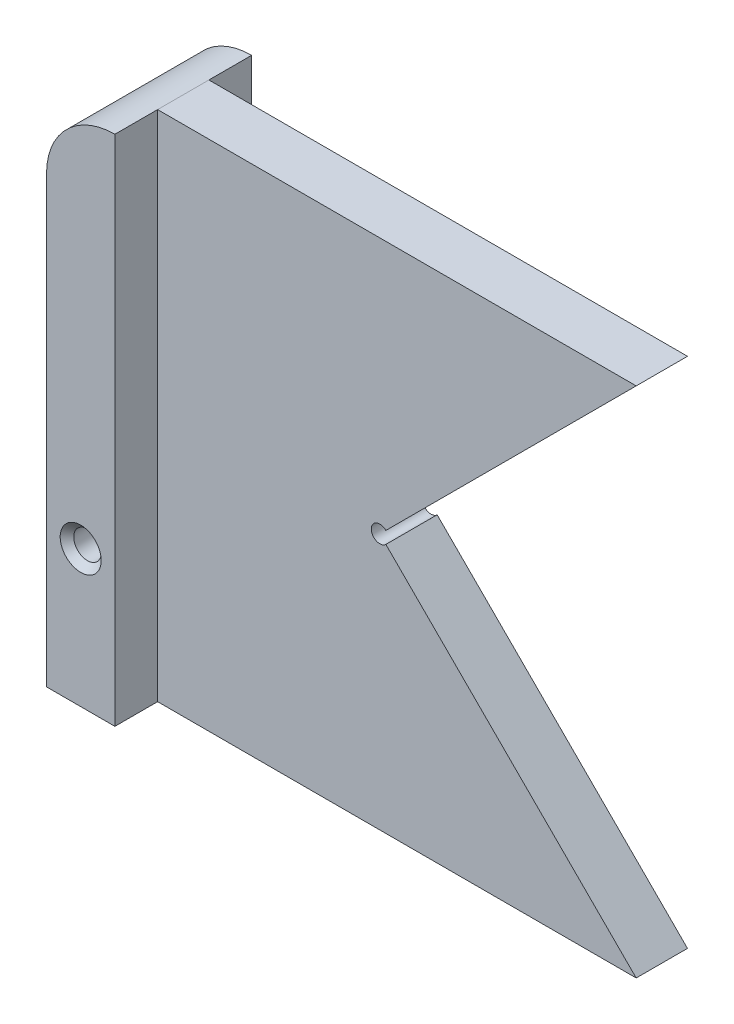
ISO-10303-21;
HEADER;
FILE_DESCRIPTION(('STEP AP214'),'2;1');
FILE_NAME('part.step','',(''),(''),'','','');
FILE_SCHEMA(('AUTOMOTIVE_DESIGN { 1 0 10303 214 1 1 1 1 }'));
ENDSEC;
DATA;
#1=APPLICATION_CONTEXT('core data for automotive mechanical design processes');
#2=APPLICATION_PROTOCOL_DEFINITION('international standard','automotive_design',2000,#1);
#3=PRODUCT_CONTEXT('',#1,'mechanical');
#4=PRODUCT('Part','Part','',(#3));
#5=PRODUCT_RELATED_PRODUCT_CATEGORY('part','',(#4));
#6=PRODUCT_DEFINITION_FORMATION('','',#4);
#7=PRODUCT_DEFINITION_CONTEXT('part definition',#1,'design');
#8=PRODUCT_DEFINITION('design','',#6,#7);
#9=PRODUCT_DEFINITION_SHAPE('','',#8);
#10=(LENGTH_UNIT() NAMED_UNIT(*) SI_UNIT(.MILLI.,.METRE.));
#11=(NAMED_UNIT(*) PLANE_ANGLE_UNIT() SI_UNIT($,.RADIAN.));
#12=(NAMED_UNIT(*) SI_UNIT($,.STERADIAN.) SOLID_ANGLE_UNIT());
#13=UNCERTAINTY_MEASURE_WITH_UNIT(LENGTH_MEASURE(1.E-05),#10,'distance_accuracy_value','');
#14=(GEOMETRIC_REPRESENTATION_CONTEXT(3) GLOBAL_UNCERTAINTY_ASSIGNED_CONTEXT((#13)) GLOBAL_UNIT_ASSIGNED_CONTEXT((#10,
#11,#12)) REPRESENTATION_CONTEXT('',''));
#15=CARTESIAN_POINT('',(0.,0.,0.));
#16=DIRECTION('',(0.,0.,1.));
#17=DIRECTION('',(1.,0.,0.));
#18=AXIS2_PLACEMENT_3D('',#15,#16,#17);
#19=CARTESIAN_POINT('',(0.,0.,12.7));
#20=DIRECTION('',(0.,0.,-1.));
#21=DIRECTION('',(-1.,0.,0.));
#22=AXIS2_PLACEMENT_3D('',#19,#20,#21);
#23=PLANE('',#22);
#24=DIRECTION('',(1.,0.,0.));
#25=VECTOR('',#24,1.);
#26=CARTESIAN_POINT('',(101.6,0.,12.7));
#27=LINE('',#26,#25);
#28=CARTESIAN_POINT('',(0.,0.,12.7));
#29=VERTEX_POINT('',#28);
#30=CARTESIAN_POINT('',(12.7,0.,12.7));
#31=VERTEX_POINT('',#30);
#32=EDGE_CURVE('E233',#29,#31,#27,.T.);
#33=ORIENTED_EDGE('',*,*,#32,.T.);
#34=DIRECTION('',(0.,1.,0.));
#35=VECTOR('',#34,1.);
#36=CARTESIAN_POINT('',(12.7,0.,12.7));
#37=LINE('',#36,#35);
#38=CARTESIAN_POINT('',(12.7,95.25,12.7));
#39=VERTEX_POINT('',#38);
#40=EDGE_CURVE('E177',#31,#39,#37,.T.);
#41=ORIENTED_EDGE('',*,*,#40,.T.);
#42=CARTESIAN_POINT('',(12.7,82.55,12.7));
#43=DIRECTION('',(0.,0.,-1.));
#44=DIRECTION('',(-1.,0.,0.));
#45=AXIS2_PLACEMENT_3D('',#42,#43,#44);
#46=CIRCLE('',#45,12.7);
#47=CARTESIAN_POINT('',(0.,82.55,12.7));
#48=VERTEX_POINT('',#47);
#49=EDGE_CURVE('E11',#39,#48,#46,.F.);
#50=ORIENTED_EDGE('',*,*,#49,.T.);
#51=DIRECTION('',(0.,-1.,0.));
#52=VECTOR('',#51,1.);
#53=CARTESIAN_POINT('',(0.,0.,12.7));
#54=LINE('',#53,#52);
#55=EDGE_CURVE('E236',#48,#29,#54,.T.);
#56=ORIENTED_EDGE('',*,*,#55,.T.);
#57=EDGE_LOOP('',(#33,#41,#50,#56));
#58=FACE_BOUND('',#57,.T.);
#59=CARTESIAN_POINT('',(6.35,25.4,12.7));
#60=DIRECTION('',(0.,0.,1.));
#61=DIRECTION('',(1.,0.,0.));
#62=AXIS2_PLACEMENT_3D('',#59,#60,#61);
#63=CIRCLE('',#62,3.81);
#64=CARTESIAN_POINT('',(10.16,25.4,12.7));
#65=VERTEX_POINT('',#64);
#66=EDGE_CURVE('E220',#65,#65,#63,.T.);
#67=ORIENTED_EDGE('',*,*,#66,.F.);
#68=EDGE_LOOP('',(#67));
#69=FACE_BOUND('',#68,.T.);
#70=ADVANCED_FACE('F38',(#58,#69),#23,.F.);
#71=CARTESIAN_POINT('',(0.,0.,-12.7));
#72=DIRECTION('',(0.,0.,-1.));
#73=DIRECTION('',(-1.,0.,0.));
#74=AXIS2_PLACEMENT_3D('',#71,#72,#73);
#75=PLANE('',#74);
#76=DIRECTION('',(0.,1.,0.));
#77=VECTOR('',#76,1.);
#78=CARTESIAN_POINT('',(12.7,0.,-12.7));
#79=LINE('',#78,#77);
#80=CARTESIAN_POINT('',(12.7,0.,-12.7));
#81=VERTEX_POINT('',#80);
#82=CARTESIAN_POINT('',(12.7,95.25,-12.7));
#83=VERTEX_POINT('',#82);
#84=EDGE_CURVE('E61',#81,#83,#79,.T.);
#85=ORIENTED_EDGE('',*,*,#84,.F.);
#86=DIRECTION('',(1.,0.,0.));
#87=VECTOR('',#86,1.);
#88=CARTESIAN_POINT('',(101.6,0.,-12.7));
#89=LINE('',#88,#87);
#90=CARTESIAN_POINT('',(0.,0.,-12.7));
#91=VERTEX_POINT('',#90);
#92=EDGE_CURVE('E232',#91,#81,#89,.T.);
#93=ORIENTED_EDGE('',*,*,#92,.F.);
#94=DIRECTION('',(0.,-1.,0.));
#95=VECTOR('',#94,1.);
#96=CARTESIAN_POINT('',(0.,0.,-12.7));
#97=LINE('',#96,#95);
#98=CARTESIAN_POINT('',(0.,82.55,-12.7));
#99=VERTEX_POINT('',#98);
#100=EDGE_CURVE('E237',#99,#91,#97,.T.);
#101=ORIENTED_EDGE('',*,*,#100,.F.);
#102=CARTESIAN_POINT('',(12.7,82.55,-12.7));
#103=DIRECTION('',(0.,0.,-1.));
#104=DIRECTION('',(-1.,0.,0.));
#105=AXIS2_PLACEMENT_3D('',#102,#103,#104);
#106=CIRCLE('',#105,12.7);
#107=EDGE_CURVE('E152',#99,#83,#106,.T.);
#108=ORIENTED_EDGE('',*,*,#107,.T.);
#109=EDGE_LOOP('',(#85,#93,#101,#108));
#110=FACE_BOUND('',#109,.T.);
#111=CARTESIAN_POINT('',(6.35,25.4,-12.7));
#112=DIRECTION('',(0.,0.,1.));
#113=DIRECTION('',(1.,0.,0.));
#114=AXIS2_PLACEMENT_3D('',#111,#112,#113);
#115=CIRCLE('',#114,3.80999999999999);
#116=CARTESIAN_POINT('',(10.16,25.4,-12.7));
#117=VERTEX_POINT('',#116);
#118=EDGE_CURVE('E217',#117,#117,#115,.T.);
#119=ORIENTED_EDGE('',*,*,#118,.T.);
#120=EDGE_LOOP('',(#119));
#121=FACE_BOUND('',#120,.T.);
#122=ADVANCED_FACE('F249',(#110,#121),#75,.T.);
#123=CARTESIAN_POINT('',(101.6,0.,12.7));
#124=DIRECTION('',(0.,1.,0.));
#125=DIRECTION('',(-1.,0.,0.));
#126=AXIS2_PLACEMENT_3D('',#123,#124,#125);
#127=PLANE('',#126);
#128=DIRECTION('',(-1.,0.,0.));
#129=VECTOR('',#128,1.);
#130=CARTESIAN_POINT('',(101.6,0.,4.7625));
#131=LINE('',#130,#129);
#132=CARTESIAN_POINT('',(101.6,0.,4.7625));
#133=VERTEX_POINT('',#132);
#134=CARTESIAN_POINT('',(12.7,0.,4.76250000000001));
#135=VERTEX_POINT('',#134);
#136=EDGE_CURVE('E119',#133,#135,#131,.T.);
#137=ORIENTED_EDGE('',*,*,#136,.T.);
#138=DIRECTION('',(0.,0.,1.));
#139=VECTOR('',#138,1.);
#140=CARTESIAN_POINT('',(12.7,0.,12.7));
#141=LINE('',#140,#139);
#142=EDGE_CURVE('E129',#135,#31,#141,.T.);
#143=ORIENTED_EDGE('',*,*,#142,.T.);
#144=ORIENTED_EDGE('',*,*,#32,.F.);
#145=DIRECTION('',(0.,0.,-1.));
#146=VECTOR('',#145,1.);
#147=CARTESIAN_POINT('',(0.,0.,12.7));
#148=LINE('',#147,#146);
#149=EDGE_CURVE('E154',#29,#91,#148,.T.);
#150=ORIENTED_EDGE('',*,*,#149,.T.);
#151=ORIENTED_EDGE('',*,*,#92,.T.);
#152=DIRECTION('',(0.,0.,1.));
#153=VECTOR('',#152,1.);
#154=CARTESIAN_POINT('',(12.7,0.,-12.7));
#155=LINE('',#154,#153);
#156=CARTESIAN_POINT('',(12.7,0.,-4.76249999999999));
#157=VERTEX_POINT('',#156);
#158=EDGE_CURVE('E184',#81,#157,#155,.T.);
#159=ORIENTED_EDGE('',*,*,#158,.T.);
#160=DIRECTION('',(1.,0.,0.));
#161=VECTOR('',#160,1.);
#162=CARTESIAN_POINT('',(101.6,0.,-4.7625));
#163=LINE('',#162,#161);
#164=CARTESIAN_POINT('',(101.6,0.,-4.7625));
#165=VERTEX_POINT('',#164);
#166=EDGE_CURVE('E147',#157,#165,#163,.T.);
#167=ORIENTED_EDGE('',*,*,#166,.T.);
#168=DIRECTION('',(0.,0.,-1.));
#169=VECTOR('',#168,1.);
#170=CARTESIAN_POINT('',(101.6,0.,12.7));
#171=LINE('',#170,#169);
#172=EDGE_CURVE('E136',#133,#165,#171,.T.);
#173=ORIENTED_EDGE('',*,*,#172,.F.);
#174=EDGE_LOOP('',(#137,#143,#144,#150,#151,#159,#167,#173));
#175=FACE_BOUND('',#174,.T.);
#176=ADVANCED_FACE('F144',(#175),#127,.F.);
#177=CARTESIAN_POINT('',(53.9749999999995,47.625,12.7));
#178=DIRECTION('',(-0.707106781186544,-0.707106781186551,0.));
#179=DIRECTION('',(0.707106781186551,-0.707106781186544,0.));
#180=AXIS2_PLACEMENT_3D('',#177,#178,#179);
#181=PLANE('',#180);
#182=DIRECTION('',(0.,0.,1.));
#183=VECTOR('',#182,1.);
#184=CARTESIAN_POINT('',(55.0975320151331,46.5024679848664,12.7));
#185=LINE('',#184,#183);
#186=CARTESIAN_POINT('',(55.0975320151331,46.5024679848664,-4.76249999999999));
#187=VERTEX_POINT('',#186);
#188=CARTESIAN_POINT('',(55.0975320151331,46.5024679848664,4.7625));
#189=VERTEX_POINT('',#188);
#190=EDGE_CURVE('E139',#187,#189,#185,.T.);
#191=ORIENTED_EDGE('',*,*,#190,.T.);
#192=DIRECTION('',(0.707106781186551,-0.707106781186544,0.));
#193=VECTOR('',#192,1.);
#194=CARTESIAN_POINT('',(53.9749999999995,47.625,4.7625));
#195=LINE('',#194,#193);
#196=EDGE_CURVE('E122',#189,#133,#195,.T.);
#197=ORIENTED_EDGE('',*,*,#196,.T.);
#198=ORIENTED_EDGE('',*,*,#172,.T.);
#199=DIRECTION('',(-0.707106781186551,0.707106781186544,0.));
#200=VECTOR('',#199,1.);
#201=CARTESIAN_POINT('',(53.9749999999995,47.625,-4.76249999999999));
#202=LINE('',#201,#200);
#203=EDGE_CURVE('E197',#165,#187,#202,.T.);
#204=ORIENTED_EDGE('',*,*,#203,.T.);
#205=EDGE_LOOP('',(#191,#197,#198,#204));
#206=FACE_BOUND('',#205,.T.);
#207=ADVANCED_FACE('F134',(#206),#181,.F.);
#208=CARTESIAN_POINT('',(101.6,95.25,12.7));
#209=DIRECTION('',(-0.707106781186544,0.707106781186551,0.));
#210=DIRECTION('',(-0.707106781186551,-0.707106781186544,0.));
#211=AXIS2_PLACEMENT_3D('',#208,#209,#210);
#212=PLANE('',#211);
#213=DIRECTION('',(0.,0.,-1.));
#214=VECTOR('',#213,1.);
#215=CARTESIAN_POINT('',(101.6,95.25,12.7));
#216=LINE('',#215,#214);
#217=CARTESIAN_POINT('',(101.6,95.25,4.7625));
#218=VERTEX_POINT('',#217);
#219=CARTESIAN_POINT('',(101.6,95.25,-4.7625));
#220=VERTEX_POINT('',#219);
#221=EDGE_CURVE('E149',#218,#220,#216,.T.);
#222=ORIENTED_EDGE('',*,*,#221,.F.);
#223=DIRECTION('',(-0.707106781186551,-0.707106781186544,0.));
#224=VECTOR('',#223,1.);
#225=CARTESIAN_POINT('',(101.6,95.25,4.7625));
#226=LINE('',#225,#224);
#227=CARTESIAN_POINT('',(55.0975320151331,48.7475320151336,4.7625));
#228=VERTEX_POINT('',#227);
#229=EDGE_CURVE('E141',#218,#228,#226,.T.);
#230=ORIENTED_EDGE('',*,*,#229,.T.);
#231=DIRECTION('',(0.,0.,1.));
#232=VECTOR('',#231,1.);
#233=CARTESIAN_POINT('',(55.0975320151331,48.7475320151336,12.7));
#234=LINE('',#233,#232);
#235=CARTESIAN_POINT('',(55.0975320151331,48.7475320151336,-4.76249999999999));
#236=VERTEX_POINT('',#235);
#237=EDGE_CURVE('E229',#228,#236,#234,.F.);
#238=ORIENTED_EDGE('',*,*,#237,.T.);
#239=DIRECTION('',(0.707106781186551,0.707106781186544,0.));
#240=VECTOR('',#239,1.);
#241=CARTESIAN_POINT('',(101.6,95.25,-4.7625));
#242=LINE('',#241,#240);
#243=EDGE_CURVE('E194',#236,#220,#242,.T.);
#244=ORIENTED_EDGE('',*,*,#243,.T.);
#245=EDGE_LOOP('',(#222,#230,#238,#244));
#246=FACE_BOUND('',#245,.T.);
#247=ADVANCED_FACE('F277',(#246),#212,.F.);
#248=CARTESIAN_POINT('',(0.,95.25,12.7));
#249=DIRECTION('',(0.,-1.,0.));
#250=DIRECTION('',(0.,0.,-1.));
#251=AXIS2_PLACEMENT_3D('',#248,#249,#250);
#252=PLANE('',#251);
#253=DIRECTION('',(0.,0.,-1.));
#254=VECTOR('',#253,1.);
#255=CARTESIAN_POINT('',(12.7,95.25,12.7));
#256=LINE('',#255,#254);
#257=CARTESIAN_POINT('',(12.7,95.25,-4.76249999999999));
#258=VERTEX_POINT('',#257);
#259=CARTESIAN_POINT('',(12.7,95.25,4.7625));
#260=VERTEX_POINT('',#259);
#261=EDGE_CURVE('E158',#258,#260,#256,.F.);
#262=ORIENTED_EDGE('',*,*,#261,.T.);
#263=DIRECTION('',(-1.,0.,0.));
#264=VECTOR('',#263,1.);
#265=CARTESIAN_POINT('',(101.6,95.25,4.7625));
#266=LINE('',#265,#264);
#267=EDGE_CURVE('E53',#218,#260,#266,.T.);
#268=ORIENTED_EDGE('',*,*,#267,.F.);
#269=ORIENTED_EDGE('',*,*,#221,.T.);
#270=DIRECTION('',(1.,0.,0.));
#271=VECTOR('',#270,1.);
#272=CARTESIAN_POINT('',(101.6,95.25,-4.7625));
#273=LINE('',#272,#271);
#274=EDGE_CURVE('E140',#258,#220,#273,.T.);
#275=ORIENTED_EDGE('',*,*,#274,.F.);
#276=EDGE_LOOP('',(#262,#268,#269,#275));
#277=FACE_BOUND('',#276,.T.);
#278=ADVANCED_FACE('F164',(#277),#252,.F.);
#279=CARTESIAN_POINT('',(0.,0.,12.7));
#280=DIRECTION('',(1.,0.,0.));
#281=DIRECTION('',(0.,0.,-1.));
#282=AXIS2_PLACEMENT_3D('',#279,#280,#281);
#283=PLANE('',#282);
#284=CARTESIAN_POINT('',(0.,41.275,0.));
#285=DIRECTION('',(-1.,0.,0.));
#286=DIRECTION('',(0.,0.,1.));
#287=AXIS2_PLACEMENT_3D('',#284,#285,#286);
#288=CIRCLE('',#287,3.81);
#289=CARTESIAN_POINT('',(0.,41.275,3.81));
#290=VERTEX_POINT('',#289);
#291=EDGE_CURVE('E199',#290,#290,#288,.T.);
#292=ORIENTED_EDGE('',*,*,#291,.F.);
#293=EDGE_LOOP('',(#292));
#294=FACE_BOUND('',#293,.T.);
#295=CARTESIAN_POINT('',(0.,9.525,0.));
#296=DIRECTION('',(-1.,0.,0.));
#297=DIRECTION('',(0.,0.,1.));
#298=AXIS2_PLACEMENT_3D('',#295,#296,#297);
#299=CIRCLE('',#298,3.81);
#300=CARTESIAN_POINT('',(0.,9.525,3.81));
#301=VERTEX_POINT('',#300);
#302=EDGE_CURVE('E208',#301,#301,#299,.T.);
#303=ORIENTED_EDGE('',*,*,#302,.F.);
#304=EDGE_LOOP('',(#303));
#305=FACE_BOUND('',#304,.T.);
#306=ORIENTED_EDGE('',*,*,#55,.F.);
#307=DIRECTION('',(0.,0.,-1.));
#308=VECTOR('',#307,1.);
#309=CARTESIAN_POINT('',(0.,82.55,12.7));
#310=LINE('',#309,#308);
#311=EDGE_CURVE('E148',#48,#99,#310,.T.);
#312=ORIENTED_EDGE('',*,*,#311,.T.);
#313=ORIENTED_EDGE('',*,*,#100,.T.);
#314=ORIENTED_EDGE('',*,*,#149,.F.);
#315=EDGE_LOOP('',(#306,#312,#313,#314));
#316=FACE_BOUND('',#315,.T.);
#317=ADVANCED_FACE('F251',(#294,#305,#316),#283,.F.);
#318=CARTESIAN_POINT('',(53.9749999999995,47.625,12.7));
#319=DIRECTION('',(0.,0.,1.));
#320=DIRECTION('',(1.,0.,0.));
#321=AXIS2_PLACEMENT_3D('',#318,#319,#320);
#322=CYLINDRICAL_SURFACE('',#321,1.58749999999998);
#323=ORIENTED_EDGE('',*,*,#237,.F.);
#324=CARTESIAN_POINT('',(53.9749999999995,47.625,4.7625));
#325=DIRECTION('',(0.,0.,-1.));
#326=DIRECTION('',(-1.,0.,0.));
#327=AXIS2_PLACEMENT_3D('',#324,#325,#326);
#328=CIRCLE('',#327,1.58749999999998);
#329=EDGE_CURVE('E179',#228,#189,#328,.F.);
#330=ORIENTED_EDGE('',*,*,#329,.T.);
#331=ORIENTED_EDGE('',*,*,#190,.F.);
#332=CARTESIAN_POINT('',(53.9749999999995,47.625,-4.76249999999999));
#333=DIRECTION('',(0.,0.,1.));
#334=DIRECTION('',(1.,0.,0.));
#335=AXIS2_PLACEMENT_3D('',#332,#333,#334);
#336=CIRCLE('',#335,1.58749999999998);
#337=EDGE_CURVE('E190',#187,#236,#336,.F.);
#338=ORIENTED_EDGE('',*,*,#337,.T.);
#339=EDGE_LOOP('',(#323,#330,#331,#338));
#340=FACE_BOUND('',#339,.T.);
#341=ADVANCED_FACE('F269',(#340),#322,.F.);
#342=CARTESIAN_POINT('',(12.7,82.55,12.7));
#343=DIRECTION('',(0.,0.,-1.));
#344=DIRECTION('',(-1.,0.,0.));
#345=AXIS2_PLACEMENT_3D('',#342,#343,#344);
#346=CYLINDRICAL_SURFACE('',#345,12.7);
#347=ORIENTED_EDGE('',*,*,#49,.F.);
#348=DIRECTION('',(0.,0.,1.));
#349=VECTOR('',#348,1.);
#350=CARTESIAN_POINT('',(12.7,95.25,12.7));
#351=LINE('',#350,#349);
#352=EDGE_CURVE('E130',#260,#39,#351,.T.);
#353=ORIENTED_EDGE('',*,*,#352,.F.);
#354=ORIENTED_EDGE('',*,*,#261,.F.);
#355=EDGE_CURVE('E46',#83,#258,#256,.F.);
#356=ORIENTED_EDGE('',*,*,#355,.F.);
#357=ORIENTED_EDGE('',*,*,#107,.F.);
#358=ORIENTED_EDGE('',*,*,#311,.F.);
#359=EDGE_LOOP('',(#347,#353,#354,#356,#357,#358));
#360=FACE_BOUND('',#359,.T.);
#361=ADVANCED_FACE('F40',(#360),#346,.T.);
#362=CARTESIAN_POINT('',(6.35,25.4,-11.4427));
#363=DIRECTION('',(0.,0.,-1.));
#364=DIRECTION('',(-1.,0.,0.));
#365=AXIS2_PLACEMENT_3D('',#362,#363,#364);
#366=CONICAL_SURFACE('',#365,2.55269999999999,0.785398163397448);
#367=ORIENTED_EDGE('',*,*,#118,.F.);
#368=EDGE_LOOP('',(#367));
#369=FACE_BOUND('',#368,.T.);
#370=CARTESIAN_POINT('',(6.35,25.4,-11.4427));
#371=DIRECTION('',(0.,0.,1.));
#372=DIRECTION('',(1.,0.,0.));
#373=AXIS2_PLACEMENT_3D('',#370,#371,#372);
#374=CIRCLE('',#373,2.55269999999999);
#375=CARTESIAN_POINT('',(8.90269999999999,25.4,-11.4427));
#376=VERTEX_POINT('',#375);
#377=EDGE_CURVE('E226',#376,#376,#374,.T.);
#378=ORIENTED_EDGE('',*,*,#377,.T.);
#379=EDGE_LOOP('',(#378));
#380=FACE_BOUND('',#379,.T.);
#381=ADVANCED_FACE('F317',(#369,#380),#366,.F.);
#382=CARTESIAN_POINT('',(6.35,25.4,12.7));
#383=DIRECTION('',(0.,0.,1.));
#384=DIRECTION('',(1.,0.,0.));
#385=AXIS2_PLACEMENT_3D('',#382,#383,#384);
#386=CYLINDRICAL_SURFACE('',#385,2.5527);
#387=ORIENTED_EDGE('',*,*,#377,.F.);
#388=EDGE_LOOP('',(#387));
#389=FACE_BOUND('',#388,.T.);
#390=CARTESIAN_POINT('',(6.35,25.4,11.4427));
#391=DIRECTION('',(0.,0.,1.));
#392=DIRECTION('',(1.,0.,0.));
#393=AXIS2_PLACEMENT_3D('',#390,#391,#392);
#394=CIRCLE('',#393,2.5527);
#395=CARTESIAN_POINT('',(8.9027,25.4,11.4427));
#396=VERTEX_POINT('',#395);
#397=EDGE_CURVE('E223',#396,#396,#394,.T.);
#398=ORIENTED_EDGE('',*,*,#397,.T.);
#399=EDGE_LOOP('',(#398));
#400=FACE_BOUND('',#399,.T.);
#401=ADVANCED_FACE('F324',(#389,#400),#386,.F.);
#402=CARTESIAN_POINT('',(6.35,25.4,12.7));
#403=DIRECTION('',(0.,0.,1.));
#404=DIRECTION('',(1.,0.,0.));
#405=AXIS2_PLACEMENT_3D('',#402,#403,#404);
#406=CONICAL_SURFACE('',#405,3.81,0.785398163397448);
#407=ORIENTED_EDGE('',*,*,#397,.F.);
#408=EDGE_LOOP('',(#407));
#409=FACE_BOUND('',#408,.T.);
#410=ORIENTED_EDGE('',*,*,#66,.T.);
#411=EDGE_LOOP('',(#410));
#412=FACE_BOUND('',#411,.T.);
#413=ADVANCED_FACE('F332',(#409,#412),#406,.F.);
#414=CARTESIAN_POINT('',(15.875,9.525,0.));
#415=DIRECTION('',(-1.,0.,0.));
#416=DIRECTION('',(0.,0.,1.));
#417=AXIS2_PLACEMENT_3D('',#414,#415,#416);
#418=CONICAL_SURFACE('',#417,2.5527,1.02974425867665);
#419=CARTESIAN_POINT('',(17.4088169021917,9.525,0.));
#420=VERTEX_POINT('',#419);
#421=VERTEX_LOOP('',#420);
#422=FACE_BOUND('',#421,.T.);
#423=CARTESIAN_POINT('',(15.875,9.525,0.));
#424=DIRECTION('',(-1.,0.,0.));
#425=DIRECTION('',(0.,0.,1.));
#426=AXIS2_PLACEMENT_3D('',#423,#424,#425);
#427=CIRCLE('',#426,2.5527);
#428=CARTESIAN_POINT('',(15.875,9.525,2.5527));
#429=VERTEX_POINT('',#428);
#430=EDGE_CURVE('E214',#429,#429,#427,.T.);
#431=ORIENTED_EDGE('',*,*,#430,.T.);
#432=EDGE_LOOP('',(#431));
#433=FACE_BOUND('',#432,.T.);
#434=ADVANCED_FACE('F339',(#422,#433),#418,.F.);
#435=CARTESIAN_POINT('',(0.,9.525,0.));
#436=DIRECTION('',(-1.,0.,0.));
#437=DIRECTION('',(0.,0.,1.));
#438=AXIS2_PLACEMENT_3D('',#435,#436,#437);
#439=CYLINDRICAL_SURFACE('',#438,2.5527);
#440=ORIENTED_EDGE('',*,*,#430,.F.);
#441=EDGE_LOOP('',(#440));
#442=FACE_BOUND('',#441,.T.);
#443=CARTESIAN_POINT('',(1.2573,9.525,0.));
#444=DIRECTION('',(-1.,0.,0.));
#445=DIRECTION('',(0.,0.,1.));
#446=AXIS2_PLACEMENT_3D('',#443,#444,#445);
#447=CIRCLE('',#446,2.5527);
#448=CARTESIAN_POINT('',(1.2573,9.525,2.5527));
#449=VERTEX_POINT('',#448);
#450=EDGE_CURVE('E211',#449,#449,#447,.T.);
#451=ORIENTED_EDGE('',*,*,#450,.T.);
#452=EDGE_LOOP('',(#451));
#453=FACE_BOUND('',#452,.T.);
#454=ADVANCED_FACE('F346',(#442,#453),#439,.F.);
#455=CARTESIAN_POINT('',(0.,9.525,0.));
#456=DIRECTION('',(-1.,0.,0.));
#457=DIRECTION('',(0.,0.,1.));
#458=AXIS2_PLACEMENT_3D('',#455,#456,#457);
#459=CONICAL_SURFACE('',#458,3.81,0.785398163397449);
#460=ORIENTED_EDGE('',*,*,#450,.F.);
#461=EDGE_LOOP('',(#460));
#462=FACE_BOUND('',#461,.T.);
#463=ORIENTED_EDGE('',*,*,#302,.T.);
#464=EDGE_LOOP('',(#463));
#465=FACE_BOUND('',#464,.T.);
#466=ADVANCED_FACE('F355',(#462,#465),#459,.F.);
#467=CARTESIAN_POINT('',(15.875,41.275,0.));
#468=DIRECTION('',(-1.,0.,0.));
#469=DIRECTION('',(0.,0.,1.));
#470=AXIS2_PLACEMENT_3D('',#467,#468,#469);
#471=CONICAL_SURFACE('',#470,2.5527,1.02974425867665);
#472=CARTESIAN_POINT('',(17.4088169021917,41.275,0.));
#473=VERTEX_POINT('',#472);
#474=VERTEX_LOOP('',#473);
#475=FACE_BOUND('',#474,.T.);
#476=CARTESIAN_POINT('',(15.875,41.275,0.));
#477=DIRECTION('',(-1.,0.,0.));
#478=DIRECTION('',(0.,0.,1.));
#479=AXIS2_PLACEMENT_3D('',#476,#477,#478);
#480=CIRCLE('',#479,2.5527);
#481=CARTESIAN_POINT('',(15.875,41.275,2.5527));
#482=VERTEX_POINT('',#481);
#483=EDGE_CURVE('E205',#482,#482,#480,.T.);
#484=ORIENTED_EDGE('',*,*,#483,.T.);
#485=EDGE_LOOP('',(#484));
#486=FACE_BOUND('',#485,.T.);
#487=ADVANCED_FACE('F364',(#475,#486),#471,.F.);
#488=CARTESIAN_POINT('',(0.,41.275,0.));
#489=DIRECTION('',(-1.,0.,0.));
#490=DIRECTION('',(0.,0.,1.));
#491=AXIS2_PLACEMENT_3D('',#488,#489,#490);
#492=CYLINDRICAL_SURFACE('',#491,2.5527);
#493=ORIENTED_EDGE('',*,*,#483,.F.);
#494=EDGE_LOOP('',(#493));
#495=FACE_BOUND('',#494,.T.);
#496=CARTESIAN_POINT('',(1.2573,41.275,0.));
#497=DIRECTION('',(-1.,0.,0.));
#498=DIRECTION('',(0.,0.,1.));
#499=AXIS2_PLACEMENT_3D('',#496,#497,#498);
#500=CIRCLE('',#499,2.5527);
#501=CARTESIAN_POINT('',(1.2573,41.275,2.5527));
#502=VERTEX_POINT('',#501);
#503=EDGE_CURVE('E202',#502,#502,#500,.T.);
#504=ORIENTED_EDGE('',*,*,#503,.T.);
#505=EDGE_LOOP('',(#504));
#506=FACE_BOUND('',#505,.T.);
#507=ADVANCED_FACE('F372',(#495,#506),#492,.F.);
#508=CARTESIAN_POINT('',(0.,41.275,0.));
#509=DIRECTION('',(-1.,0.,0.));
#510=DIRECTION('',(0.,0.,1.));
#511=AXIS2_PLACEMENT_3D('',#508,#509,#510);
#512=CONICAL_SURFACE('',#511,3.81,0.785398163397449);
#513=ORIENTED_EDGE('',*,*,#503,.F.);
#514=EDGE_LOOP('',(#513));
#515=FACE_BOUND('',#514,.T.);
#516=ORIENTED_EDGE('',*,*,#291,.T.);
#517=EDGE_LOOP('',(#516));
#518=FACE_BOUND('',#517,.T.);
#519=ADVANCED_FACE('F380',(#515,#518),#512,.F.);
#520=CARTESIAN_POINT('',(101.6,0.,-4.7625));
#521=DIRECTION('',(0.,0.,1.));
#522=DIRECTION('',(1.,0.,0.));
#523=AXIS2_PLACEMENT_3D('',#520,#521,#522);
#524=PLANE('',#523);
#525=ORIENTED_EDGE('',*,*,#166,.F.);
#526=DIRECTION('',(0.,1.,0.));
#527=VECTOR('',#526,1.);
#528=CARTESIAN_POINT('',(12.7,0.,-4.76249999999999));
#529=LINE('',#528,#527);
#530=EDGE_CURVE('E188',#157,#258,#529,.T.);
#531=ORIENTED_EDGE('',*,*,#530,.T.);
#532=ORIENTED_EDGE('',*,*,#274,.T.);
#533=ORIENTED_EDGE('',*,*,#243,.F.);
#534=ORIENTED_EDGE('',*,*,#337,.F.);
#535=ORIENTED_EDGE('',*,*,#203,.F.);
#536=EDGE_LOOP('',(#525,#531,#532,#533,#534,#535));
#537=FACE_BOUND('',#536,.T.);
#538=ADVANCED_FACE('F387',(#537),#524,.F.);
#539=CARTESIAN_POINT('',(12.7,0.,-12.7));
#540=DIRECTION('',(-1.,0.,0.));
#541=DIRECTION('',(0.,0.,1.));
#542=AXIS2_PLACEMENT_3D('',#539,#540,#541);
#543=PLANE('',#542);
#544=ORIENTED_EDGE('',*,*,#355,.T.);
#545=ORIENTED_EDGE('',*,*,#530,.F.);
#546=ORIENTED_EDGE('',*,*,#158,.F.);
#547=ORIENTED_EDGE('',*,*,#84,.T.);
#548=EDGE_LOOP('',(#544,#545,#546,#547));
#549=FACE_BOUND('',#548,.T.);
#550=ADVANCED_FACE('F260',(#549),#543,.F.);
#551=CARTESIAN_POINT('',(101.6,0.,4.7625));
#552=DIRECTION('',(0.,0.,-1.));
#553=DIRECTION('',(-1.,0.,0.));
#554=AXIS2_PLACEMENT_3D('',#551,#552,#553);
#555=PLANE('',#554);
#556=ORIENTED_EDGE('',*,*,#329,.F.);
#557=ORIENTED_EDGE('',*,*,#229,.F.);
#558=ORIENTED_EDGE('',*,*,#267,.T.);
#559=DIRECTION('',(0.,1.,0.));
#560=VECTOR('',#559,1.);
#561=CARTESIAN_POINT('',(12.7,0.,4.76250000000001));
#562=LINE('',#561,#560);
#563=EDGE_CURVE('E124',#135,#260,#562,.T.);
#564=ORIENTED_EDGE('',*,*,#563,.F.);
#565=ORIENTED_EDGE('',*,*,#136,.F.);
#566=ORIENTED_EDGE('',*,*,#196,.F.);
#567=EDGE_LOOP('',(#556,#557,#558,#564,#565,#566));
#568=FACE_BOUND('',#567,.T.);
#569=ADVANCED_FACE('F121',(#568),#555,.F.);
#570=CARTESIAN_POINT('',(12.7,0.,12.7));
#571=DIRECTION('',(-1.,0.,0.));
#572=DIRECTION('',(0.,0.,1.));
#573=AXIS2_PLACEMENT_3D('',#570,#571,#572);
#574=PLANE('',#573);
#575=ORIENTED_EDGE('',*,*,#352,.T.);
#576=ORIENTED_EDGE('',*,*,#40,.F.);
#577=ORIENTED_EDGE('',*,*,#142,.F.);
#578=ORIENTED_EDGE('',*,*,#563,.T.);
#579=EDGE_LOOP('',(#575,#576,#577,#578));
#580=FACE_BOUND('',#579,.T.);
#581=ADVANCED_FACE('F254',(#580),#574,.F.);
#582=CLOSED_SHELL('',(#70,#122,#176,#207,#247,#278,#317,#341,#361,#381,#401,#413,#434,#454,#466,
#487,#507,#519,#538,#550,#569,#581));
#583=MANIFOLD_SOLID_BREP('B2',#582);
#584=ADVANCED_BREP_SHAPE_REPRESENTATION('',(#18,#583),#14);
#585=SHAPE_DEFINITION_REPRESENTATION(#9,#584);
ENDSEC;
END-ISO-10303-21;
